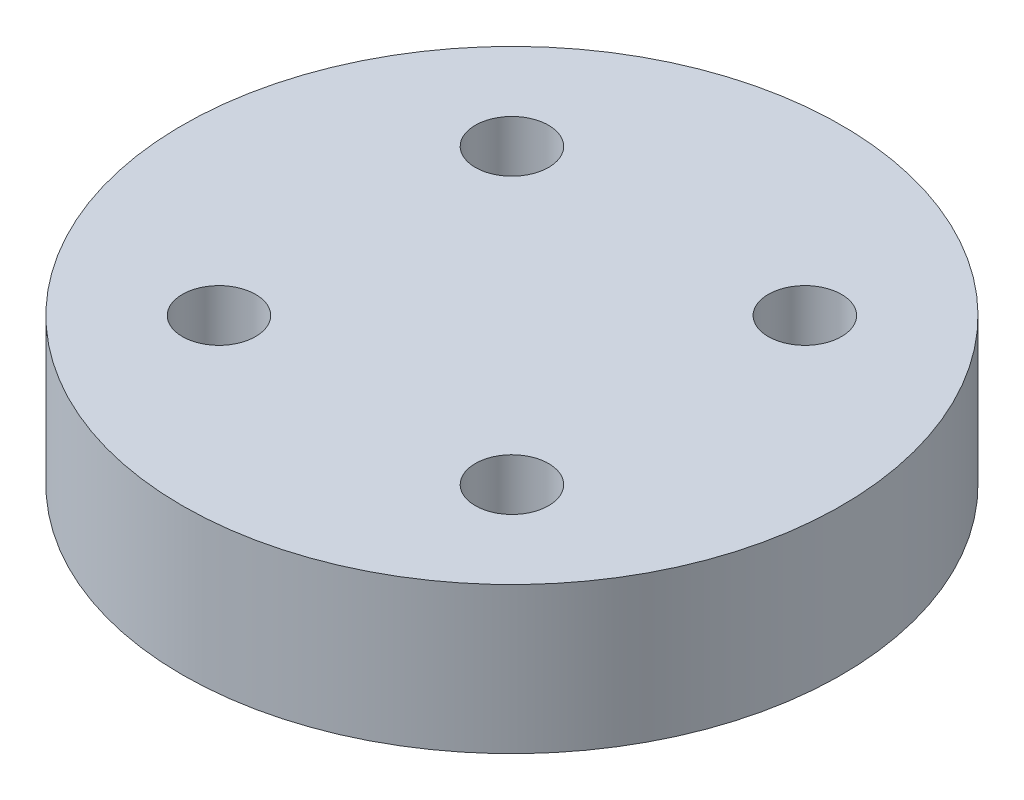
ISO-10303-21;
HEADER;
FILE_DESCRIPTION(('STEP AP214'),'2;1');
FILE_NAME('part.step','',(''),(''),'','','');
FILE_SCHEMA(('AUTOMOTIVE_DESIGN { 1 0 10303 214 1 1 1 1 }'));
ENDSEC;
DATA;
#1=APPLICATION_CONTEXT('core data for automotive mechanical design processes');
#2=APPLICATION_PROTOCOL_DEFINITION('international standard','automotive_design',2000,#1);
#3=PRODUCT_CONTEXT('',#1,'mechanical');
#4=PRODUCT('Part','Part','',(#3));
#5=PRODUCT_RELATED_PRODUCT_CATEGORY('part','',(#4));
#6=PRODUCT_DEFINITION_FORMATION('','',#4);
#7=PRODUCT_DEFINITION_CONTEXT('part definition',#1,'design');
#8=PRODUCT_DEFINITION('design','',#6,#7);
#9=PRODUCT_DEFINITION_SHAPE('','',#8);
#10=(LENGTH_UNIT() NAMED_UNIT(*) SI_UNIT(.MILLI.,.METRE.));
#11=(NAMED_UNIT(*) PLANE_ANGLE_UNIT() SI_UNIT($,.RADIAN.));
#12=(NAMED_UNIT(*) SI_UNIT($,.STERADIAN.) SOLID_ANGLE_UNIT());
#13=UNCERTAINTY_MEASURE_WITH_UNIT(LENGTH_MEASURE(1.E-05),#10,'distance_accuracy_value','');
#14=(GEOMETRIC_REPRESENTATION_CONTEXT(3) GLOBAL_UNCERTAINTY_ASSIGNED_CONTEXT((#13)) GLOBAL_UNIT_ASSIGNED_CONTEXT((#10,
#11,#12)) REPRESENTATION_CONTEXT('',''));
#15=CARTESIAN_POINT('',(0.,0.,0.));
#16=DIRECTION('',(0.,0.,1.));
#17=DIRECTION('',(1.,0.,0.));
#18=AXIS2_PLACEMENT_3D('',#15,#16,#17);
#19=CARTESIAN_POINT('',(0.,2.,0.));
#20=DIRECTION('',(0.,1.,0.));
#21=DIRECTION('',(0.,0.,1.));
#22=AXIS2_PLACEMENT_3D('',#19,#20,#21);
#23=PLANE('',#22);
#24=CARTESIAN_POINT('',(4.,2.,4.));
#25=DIRECTION('',(0.,1.,0.));
#26=DIRECTION('',(0.,0.,1.));
#27=AXIS2_PLACEMENT_3D('',#24,#25,#26);
#28=CIRCLE('',#27,1.);
#29=CARTESIAN_POINT('',(4.,2.,5.));
#30=VERTEX_POINT('',#29);
#31=EDGE_CURVE('E66',#30,#30,#28,.T.);
#32=ORIENTED_EDGE('',*,*,#31,.F.);
#33=EDGE_LOOP('',(#32));
#34=FACE_BOUND('',#33,.T.);
#35=CARTESIAN_POINT('',(-4.,2.,-4.));
#36=DIRECTION('',(0.,1.,0.));
#37=DIRECTION('',(0.,0.,1.));
#38=AXIS2_PLACEMENT_3D('',#35,#36,#37);
#39=CIRCLE('',#38,1.);
#40=CARTESIAN_POINT('',(-4.,2.,-3.));
#41=VERTEX_POINT('',#40);
#42=EDGE_CURVE('E52',#41,#41,#39,.T.);
#43=ORIENTED_EDGE('',*,*,#42,.F.);
#44=EDGE_LOOP('',(#43));
#45=FACE_BOUND('',#44,.T.);
#46=CARTESIAN_POINT('',(0.,2.,0.));
#47=DIRECTION('',(0.,1.,0.));
#48=DIRECTION('',(0.,0.,1.));
#49=AXIS2_PLACEMENT_3D('',#46,#47,#48);
#50=CIRCLE('',#49,9.);
#51=CARTESIAN_POINT('',(0.,2.,9.));
#52=VERTEX_POINT('',#51);
#53=EDGE_CURVE('E10',#52,#52,#50,.T.);
#54=ORIENTED_EDGE('',*,*,#53,.T.);
#55=EDGE_LOOP('',(#54));
#56=FACE_BOUND('',#55,.T.);
#57=CARTESIAN_POINT('',(4.,2.,-4.));
#58=DIRECTION('',(0.,1.,0.));
#59=DIRECTION('',(0.,0.,1.));
#60=AXIS2_PLACEMENT_3D('',#57,#58,#59);
#61=CIRCLE('',#60,1.);
#62=CARTESIAN_POINT('',(4.,2.,-3.));
#63=VERTEX_POINT('',#62);
#64=EDGE_CURVE('E58',#63,#63,#61,.T.);
#65=ORIENTED_EDGE('',*,*,#64,.F.);
#66=EDGE_LOOP('',(#65));
#67=FACE_BOUND('',#66,.T.);
#68=CARTESIAN_POINT('',(-4.,2.,4.));
#69=DIRECTION('',(0.,1.,0.));
#70=DIRECTION('',(0.,0.,1.));
#71=AXIS2_PLACEMENT_3D('',#68,#69,#70);
#72=CIRCLE('',#71,1.);
#73=CARTESIAN_POINT('',(-4.,2.,5.));
#74=VERTEX_POINT('',#73);
#75=EDGE_CURVE('E74',#74,#74,#72,.T.);
#76=ORIENTED_EDGE('',*,*,#75,.F.);
#77=EDGE_LOOP('',(#76));
#78=FACE_BOUND('',#77,.T.);
#79=ADVANCED_FACE('F39',(#34,#45,#56,#67,#78),#23,.T.);
#80=CARTESIAN_POINT('',(0.,-2.,0.));
#81=DIRECTION('',(0.,1.,0.));
#82=DIRECTION('',(0.,0.,1.));
#83=AXIS2_PLACEMENT_3D('',#80,#81,#82);
#84=PLANE('',#83);
#85=CARTESIAN_POINT('',(0.,-2.,0.));
#86=DIRECTION('',(0.,1.,0.));
#87=DIRECTION('',(0.,0.,1.));
#88=AXIS2_PLACEMENT_3D('',#85,#86,#87);
#89=CIRCLE('',#88,9.);
#90=CARTESIAN_POINT('',(0.,-2.,9.));
#91=VERTEX_POINT('',#90);
#92=EDGE_CURVE('E43',#91,#91,#89,.T.);
#93=ORIENTED_EDGE('',*,*,#92,.F.);
#94=EDGE_LOOP('',(#93));
#95=FACE_BOUND('',#94,.T.);
#96=CARTESIAN_POINT('',(-4.,-2.,-4.));
#97=DIRECTION('',(0.,1.,0.));
#98=DIRECTION('',(0.,0.,1.));
#99=AXIS2_PLACEMENT_3D('',#96,#97,#98);
#100=CIRCLE('',#99,1.);
#101=CARTESIAN_POINT('',(-4.,-2.,-3.));
#102=VERTEX_POINT('',#101);
#103=EDGE_CURVE('E54',#102,#102,#100,.T.);
#104=ORIENTED_EDGE('',*,*,#103,.T.);
#105=EDGE_LOOP('',(#104));
#106=FACE_BOUND('',#105,.T.);
#107=CARTESIAN_POINT('',(4.,-2.,-4.));
#108=DIRECTION('',(0.,1.,0.));
#109=DIRECTION('',(0.,0.,1.));
#110=AXIS2_PLACEMENT_3D('',#107,#108,#109);
#111=CIRCLE('',#110,1.);
#112=CARTESIAN_POINT('',(4.,-2.,-3.));
#113=VERTEX_POINT('',#112);
#114=EDGE_CURVE('E62',#113,#113,#111,.T.);
#115=ORIENTED_EDGE('',*,*,#114,.T.);
#116=EDGE_LOOP('',(#115));
#117=FACE_BOUND('',#116,.T.);
#118=CARTESIAN_POINT('',(4.,-2.,4.));
#119=DIRECTION('',(0.,1.,0.));
#120=DIRECTION('',(0.,0.,1.));
#121=AXIS2_PLACEMENT_3D('',#118,#119,#120);
#122=CIRCLE('',#121,1.);
#123=CARTESIAN_POINT('',(4.,-2.,5.));
#124=VERTEX_POINT('',#123);
#125=EDGE_CURVE('E70',#124,#124,#122,.T.);
#126=ORIENTED_EDGE('',*,*,#125,.T.);
#127=EDGE_LOOP('',(#126));
#128=FACE_BOUND('',#127,.T.);
#129=CARTESIAN_POINT('',(-4.,-2.,4.));
#130=DIRECTION('',(0.,1.,0.));
#131=DIRECTION('',(0.,0.,1.));
#132=AXIS2_PLACEMENT_3D('',#129,#130,#131);
#133=CIRCLE('',#132,1.);
#134=CARTESIAN_POINT('',(-4.,-2.,5.));
#135=VERTEX_POINT('',#134);
#136=EDGE_CURVE('E78',#135,#135,#133,.T.);
#137=ORIENTED_EDGE('',*,*,#136,.T.);
#138=EDGE_LOOP('',(#137));
#139=FACE_BOUND('',#138,.T.);
#140=ADVANCED_FACE('F90',(#95,#106,#117,#128,#139),#84,.F.);
#141=CARTESIAN_POINT('',(0.,2.,0.));
#142=DIRECTION('',(0.,-1.,0.));
#143=DIRECTION('',(0.,0.,-1.));
#144=AXIS2_PLACEMENT_3D('',#141,#142,#143);
#145=CYLINDRICAL_SURFACE('',#144,9.);
#146=ORIENTED_EDGE('',*,*,#53,.F.);
#147=EDGE_LOOP('',(#146));
#148=FACE_BOUND('',#147,.T.);
#149=ORIENTED_EDGE('',*,*,#92,.T.);
#150=EDGE_LOOP('',(#149));
#151=FACE_BOUND('',#150,.T.);
#152=ADVANCED_FACE('F41',(#148,#151),#145,.T.);
#153=CARTESIAN_POINT('',(-4.,2.,-4.));
#154=DIRECTION('',(0.,-1.,0.));
#155=DIRECTION('',(0.,0.,-1.));
#156=AXIS2_PLACEMENT_3D('',#153,#154,#155);
#157=CYLINDRICAL_SURFACE('',#156,1.);
#158=ORIENTED_EDGE('',*,*,#42,.T.);
#159=EDGE_LOOP('',(#158));
#160=FACE_BOUND('',#159,.T.);
#161=ORIENTED_EDGE('',*,*,#103,.F.);
#162=EDGE_LOOP('',(#161));
#163=FACE_BOUND('',#162,.T.);
#164=ADVANCED_FACE('F100',(#160,#163),#157,.F.);
#165=CARTESIAN_POINT('',(4.,2.,-4.));
#166=DIRECTION('',(0.,-1.,0.));
#167=DIRECTION('',(0.,0.,-1.));
#168=AXIS2_PLACEMENT_3D('',#165,#166,#167);
#169=CYLINDRICAL_SURFACE('',#168,1.);
#170=ORIENTED_EDGE('',*,*,#64,.T.);
#171=EDGE_LOOP('',(#170));
#172=FACE_BOUND('',#171,.T.);
#173=ORIENTED_EDGE('',*,*,#114,.F.);
#174=EDGE_LOOP('',(#173));
#175=FACE_BOUND('',#174,.T.);
#176=ADVANCED_FACE('F103',(#172,#175),#169,.F.);
#177=CARTESIAN_POINT('',(4.,2.,4.));
#178=DIRECTION('',(0.,-1.,0.));
#179=DIRECTION('',(0.,0.,-1.));
#180=AXIS2_PLACEMENT_3D('',#177,#178,#179);
#181=CYLINDRICAL_SURFACE('',#180,1.);
#182=ORIENTED_EDGE('',*,*,#31,.T.);
#183=EDGE_LOOP('',(#182));
#184=FACE_BOUND('',#183,.T.);
#185=ORIENTED_EDGE('',*,*,#125,.F.);
#186=EDGE_LOOP('',(#185));
#187=FACE_BOUND('',#186,.T.);
#188=ADVANCED_FACE('F107',(#184,#187),#181,.F.);
#189=CARTESIAN_POINT('',(-4.,2.,4.));
#190=DIRECTION('',(0.,-1.,0.));
#191=DIRECTION('',(0.,0.,-1.));
#192=AXIS2_PLACEMENT_3D('',#189,#190,#191);
#193=CYLINDRICAL_SURFACE('',#192,1.);
#194=ORIENTED_EDGE('',*,*,#75,.T.);
#195=EDGE_LOOP('',(#194));
#196=FACE_BOUND('',#195,.T.);
#197=ORIENTED_EDGE('',*,*,#136,.F.);
#198=EDGE_LOOP('',(#197));
#199=FACE_BOUND('',#198,.T.);
#200=ADVANCED_FACE('F86',(#196,#199),#193,.F.);
#201=CLOSED_SHELL('',(#79,#140,#152,#164,#176,#188,#200));
#202=MANIFOLD_SOLID_BREP('B2',#201);
#203=ADVANCED_BREP_SHAPE_REPRESENTATION('',(#18,#202),#14);
#204=SHAPE_DEFINITION_REPRESENTATION(#9,#203);
ENDSEC;
END-ISO-10303-21;
